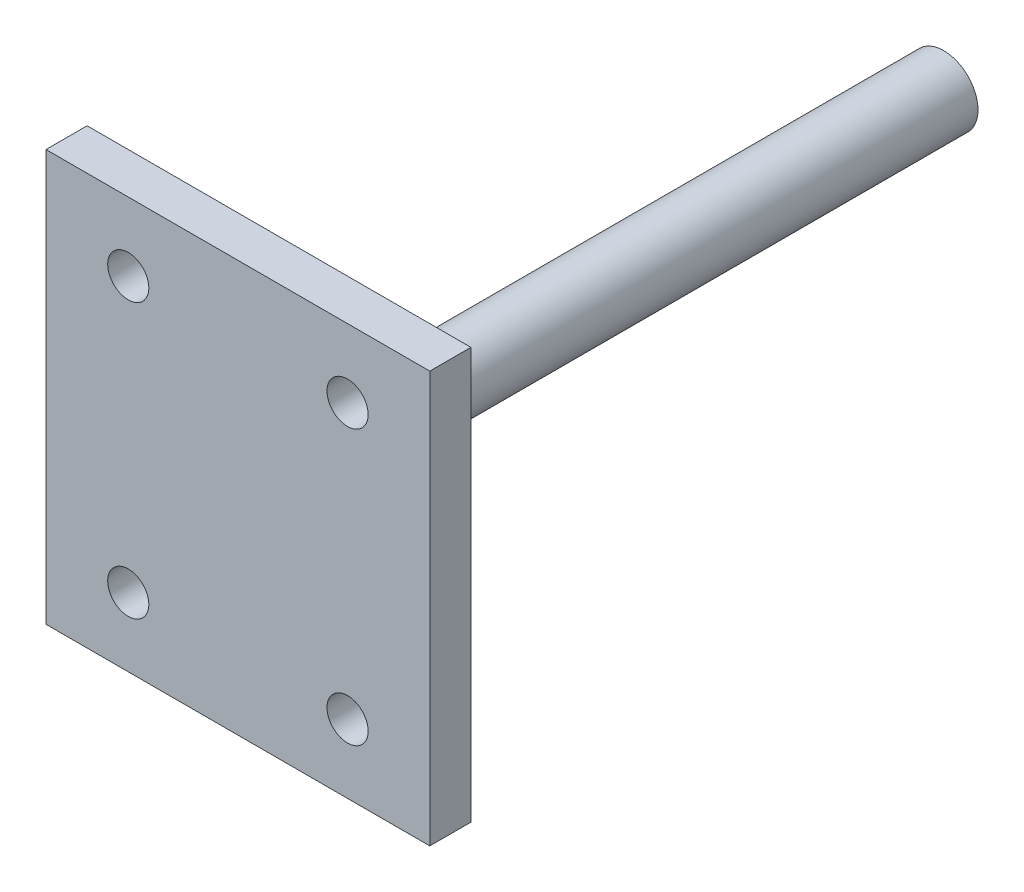
ISO-10303-21;
HEADER;
FILE_DESCRIPTION(('STEP AP214'),'2;1');
FILE_NAME('part.step','',(''),(''),'','','');
FILE_SCHEMA(('AUTOMOTIVE_DESIGN { 1 0 10303 214 1 1 1 1 }'));
ENDSEC;
DATA;
#1=APPLICATION_CONTEXT('core data for automotive mechanical design processes');
#2=APPLICATION_PROTOCOL_DEFINITION('international standard','automotive_design',2000,#1);
#3=PRODUCT_CONTEXT('',#1,'mechanical');
#4=PRODUCT('Part','Part','',(#3));
#5=PRODUCT_RELATED_PRODUCT_CATEGORY('part','',(#4));
#6=PRODUCT_DEFINITION_FORMATION('','',#4);
#7=PRODUCT_DEFINITION_CONTEXT('part definition',#1,'design');
#8=PRODUCT_DEFINITION('design','',#6,#7);
#9=PRODUCT_DEFINITION_SHAPE('','',#8);
#10=(LENGTH_UNIT() NAMED_UNIT(*) SI_UNIT(.MILLI.,.METRE.));
#11=(NAMED_UNIT(*) PLANE_ANGLE_UNIT() SI_UNIT($,.RADIAN.));
#12=(NAMED_UNIT(*) SI_UNIT($,.STERADIAN.) SOLID_ANGLE_UNIT());
#13=UNCERTAINTY_MEASURE_WITH_UNIT(LENGTH_MEASURE(1.E-05),#10,'distance_accuracy_value','');
#14=(GEOMETRIC_REPRESENTATION_CONTEXT(3) GLOBAL_UNCERTAINTY_ASSIGNED_CONTEXT((#13)) GLOBAL_UNIT_ASSIGNED_CONTEXT((#10,
#11,#12)) REPRESENTATION_CONTEXT('',''));
#15=CARTESIAN_POINT('',(0.,0.,0.));
#16=DIRECTION('',(0.,0.,1.));
#17=DIRECTION('',(1.,0.,0.));
#18=AXIS2_PLACEMENT_3D('',#15,#16,#17);
#19=CARTESIAN_POINT('',(0.,0.,3.));
#20=DIRECTION('',(1.,0.,0.));
#21=DIRECTION('',(0.,1.,0.));
#22=AXIS2_PLACEMENT_3D('',#19,#20,#21);
#23=PLANE('',#22);
#24=DIRECTION('',(0.,-1.,0.));
#25=VECTOR('',#24,1.);
#26=CARTESIAN_POINT('',(0.,0.,0.));
#27=LINE('',#26,#25);
#28=CARTESIAN_POINT('',(0.,30.,0.));
#29=VERTEX_POINT('',#28);
#30=CARTESIAN_POINT('',(0.,0.,0.));
#31=VERTEX_POINT('',#30);
#32=EDGE_CURVE('E98',#29,#31,#27,.T.);
#33=ORIENTED_EDGE('',*,*,#32,.T.);
#34=DIRECTION('',(0.,0.,-1.));
#35=VECTOR('',#34,1.);
#36=CARTESIAN_POINT('',(0.,0.,3.));
#37=LINE('',#36,#35);
#38=CARTESIAN_POINT('',(0.,0.,3.));
#39=VERTEX_POINT('',#38);
#40=EDGE_CURVE('E11',#39,#31,#37,.T.);
#41=ORIENTED_EDGE('',*,*,#40,.F.);
#42=DIRECTION('',(0.,-1.,0.));
#43=VECTOR('',#42,1.);
#44=CARTESIAN_POINT('',(0.,0.,3.));
#45=LINE('',#44,#43);
#46=CARTESIAN_POINT('',(0.,30.,3.));
#47=VERTEX_POINT('',#46);
#48=EDGE_CURVE('E86',#47,#39,#45,.T.);
#49=ORIENTED_EDGE('',*,*,#48,.F.);
#50=DIRECTION('',(0.,0.,-1.));
#51=VECTOR('',#50,1.);
#52=CARTESIAN_POINT('',(0.,30.,3.));
#53=LINE('',#52,#51);
#54=EDGE_CURVE('E94',#47,#29,#53,.T.);
#55=ORIENTED_EDGE('',*,*,#54,.T.);
#56=EDGE_LOOP('',(#33,#41,#49,#55));
#57=FACE_BOUND('',#56,.T.);
#58=ADVANCED_FACE('F35',(#57),#23,.F.);
#59=CARTESIAN_POINT('',(0.,0.,3.));
#60=DIRECTION('',(0.,1.,0.));
#61=DIRECTION('',(0.,0.,1.));
#62=AXIS2_PLACEMENT_3D('',#59,#60,#61);
#63=PLANE('',#62);
#64=DIRECTION('',(1.,0.,0.));
#65=VECTOR('',#64,1.);
#66=CARTESIAN_POINT('',(0.,0.,0.));
#67=LINE('',#66,#65);
#68=CARTESIAN_POINT('',(28.,0.,0.));
#69=VERTEX_POINT('',#68);
#70=EDGE_CURVE('E90',#31,#69,#67,.T.);
#71=ORIENTED_EDGE('',*,*,#70,.T.);
#72=DIRECTION('',(0.,0.,-1.));
#73=VECTOR('',#72,1.);
#74=CARTESIAN_POINT('',(28.,0.,3.));
#75=LINE('',#74,#73);
#76=CARTESIAN_POINT('',(28.,0.,3.));
#77=VERTEX_POINT('',#76);
#78=EDGE_CURVE('E43',#77,#69,#75,.T.);
#79=ORIENTED_EDGE('',*,*,#78,.F.);
#80=DIRECTION('',(1.,0.,0.));
#81=VECTOR('',#80,1.);
#82=CARTESIAN_POINT('',(0.,0.,3.));
#83=LINE('',#82,#81);
#84=EDGE_CURVE('E81',#39,#77,#83,.T.);
#85=ORIENTED_EDGE('',*,*,#84,.F.);
#86=ORIENTED_EDGE('',*,*,#40,.T.);
#87=EDGE_LOOP('',(#71,#79,#85,#86));
#88=FACE_BOUND('',#87,.T.);
#89=ADVANCED_FACE('F89',(#88),#63,.F.);
#90=CARTESIAN_POINT('',(28.,0.,3.));
#91=DIRECTION('',(-1.,0.,0.));
#92=DIRECTION('',(0.,-1.,0.));
#93=AXIS2_PLACEMENT_3D('',#90,#91,#92);
#94=PLANE('',#93);
#95=DIRECTION('',(0.,1.,0.));
#96=VECTOR('',#95,1.);
#97=CARTESIAN_POINT('',(28.,0.,0.));
#98=LINE('',#97,#96);
#99=CARTESIAN_POINT('',(28.,30.,0.));
#100=VERTEX_POINT('',#99);
#101=EDGE_CURVE('E68',#69,#100,#98,.T.);
#102=ORIENTED_EDGE('',*,*,#101,.T.);
#103=DIRECTION('',(0.,0.,-1.));
#104=VECTOR('',#103,1.);
#105=CARTESIAN_POINT('',(28.,30.,3.));
#106=LINE('',#105,#104);
#107=CARTESIAN_POINT('',(28.,30.,3.));
#108=VERTEX_POINT('',#107);
#109=EDGE_CURVE('E91',#108,#100,#106,.T.);
#110=ORIENTED_EDGE('',*,*,#109,.F.);
#111=DIRECTION('',(0.,1.,0.));
#112=VECTOR('',#111,1.);
#113=CARTESIAN_POINT('',(28.,0.,3.));
#114=LINE('',#113,#112);
#115=EDGE_CURVE('E84',#77,#108,#114,.T.);
#116=ORIENTED_EDGE('',*,*,#115,.F.);
#117=ORIENTED_EDGE('',*,*,#78,.T.);
#118=EDGE_LOOP('',(#102,#110,#116,#117));
#119=FACE_BOUND('',#118,.T.);
#120=ADVANCED_FACE('F92',(#119),#94,.F.);
#121=CARTESIAN_POINT('',(0.,30.,3.));
#122=DIRECTION('',(0.,-1.,0.));
#123=DIRECTION('',(0.,0.,-1.));
#124=AXIS2_PLACEMENT_3D('',#121,#122,#123);
#125=PLANE('',#124);
#126=DIRECTION('',(-1.,0.,0.));
#127=VECTOR('',#126,1.);
#128=CARTESIAN_POINT('',(0.,30.,0.));
#129=LINE('',#128,#127);
#130=EDGE_CURVE('E74',#100,#29,#129,.T.);
#131=ORIENTED_EDGE('',*,*,#130,.T.);
#132=ORIENTED_EDGE('',*,*,#54,.F.);
#133=DIRECTION('',(-1.,0.,0.));
#134=VECTOR('',#133,1.);
#135=CARTESIAN_POINT('',(0.,30.,3.));
#136=LINE('',#135,#134);
#137=EDGE_CURVE('E51',#108,#47,#136,.T.);
#138=ORIENTED_EDGE('',*,*,#137,.F.);
#139=ORIENTED_EDGE('',*,*,#109,.T.);
#140=EDGE_LOOP('',(#131,#132,#138,#139));
#141=FACE_BOUND('',#140,.T.);
#142=ADVANCED_FACE('F106',(#141),#125,.F.);
#143=CARTESIAN_POINT('',(0.,0.,3.));
#144=DIRECTION('',(0.,0.,-1.));
#145=DIRECTION('',(-1.,0.,0.));
#146=AXIS2_PLACEMENT_3D('',#143,#144,#145);
#147=PLANE('',#146);
#148=CARTESIAN_POINT('',(6.,5.,3.));
#149=DIRECTION('',(0.,0.,-1.));
#150=DIRECTION('',(-1.,0.,0.));
#151=AXIS2_PLACEMENT_3D('',#148,#149,#150);
#152=CIRCLE('',#151,1.5);
#153=CARTESIAN_POINT('',(4.5,5.,3.));
#154=VERTEX_POINT('',#153);
#155=EDGE_CURVE('E101',#154,#154,#152,.F.);
#156=ORIENTED_EDGE('',*,*,#155,.F.);
#157=EDGE_LOOP('',(#156));
#158=FACE_BOUND('',#157,.T.);
#159=CARTESIAN_POINT('',(22.,5.,3.));
#160=DIRECTION('',(0.,0.,-1.));
#161=DIRECTION('',(-1.,0.,0.));
#162=AXIS2_PLACEMENT_3D('',#159,#160,#161);
#163=CIRCLE('',#162,1.5);
#164=CARTESIAN_POINT('',(20.5,5.,3.));
#165=VERTEX_POINT('',#164);
#166=EDGE_CURVE('E114',#165,#165,#163,.F.);
#167=ORIENTED_EDGE('',*,*,#166,.F.);
#168=EDGE_LOOP('',(#167));
#169=FACE_BOUND('',#168,.T.);
#170=CARTESIAN_POINT('',(22.,25.,3.));
#171=DIRECTION('',(0.,0.,-1.));
#172=DIRECTION('',(-1.,0.,0.));
#173=AXIS2_PLACEMENT_3D('',#170,#171,#172);
#174=CIRCLE('',#173,1.5);
#175=CARTESIAN_POINT('',(20.5,25.,3.));
#176=VERTEX_POINT('',#175);
#177=EDGE_CURVE('E117',#176,#176,#174,.F.);
#178=ORIENTED_EDGE('',*,*,#177,.F.);
#179=EDGE_LOOP('',(#178));
#180=FACE_BOUND('',#179,.T.);
#181=CARTESIAN_POINT('',(6.,25.,3.));
#182=DIRECTION('',(0.,0.,-1.));
#183=DIRECTION('',(-1.,0.,0.));
#184=AXIS2_PLACEMENT_3D('',#181,#182,#183);
#185=CIRCLE('',#184,1.5);
#186=CARTESIAN_POINT('',(4.5,25.,3.));
#187=VERTEX_POINT('',#186);
#188=EDGE_CURVE('E120',#187,#187,#185,.F.);
#189=ORIENTED_EDGE('',*,*,#188,.F.);
#190=EDGE_LOOP('',(#189));
#191=FACE_BOUND('',#190,.T.);
#192=ORIENTED_EDGE('',*,*,#48,.T.);
#193=ORIENTED_EDGE('',*,*,#84,.T.);
#194=ORIENTED_EDGE('',*,*,#115,.T.);
#195=ORIENTED_EDGE('',*,*,#137,.T.);
#196=EDGE_LOOP('',(#192,#193,#194,#195));
#197=FACE_BOUND('',#196,.T.);
#198=ADVANCED_FACE('F82',(#158,#169,#180,#191,#197),#147,.F.);
#199=CARTESIAN_POINT('',(0.,0.,0.));
#200=DIRECTION('',(0.,0.,-1.));
#201=DIRECTION('',(-1.,0.,0.));
#202=AXIS2_PLACEMENT_3D('',#199,#200,#201);
#203=PLANE('',#202);
#204=CARTESIAN_POINT('',(14.000000000005,14.9999999999932,0.));
#205=DIRECTION('',(0.,0.,-1.));
#206=DIRECTION('',(-1.,0.,0.));
#207=AXIS2_PLACEMENT_3D('',#204,#205,#206);
#208=CIRCLE('',#207,2.495);
#209=CARTESIAN_POINT('',(16.495000000005,14.9999999999932,0.));
#210=VERTEX_POINT('',#209);
#211=EDGE_CURVE('E136',#210,#210,#208,.T.);
#212=ORIENTED_EDGE('',*,*,#211,.F.);
#213=EDGE_LOOP('',(#212));
#214=FACE_BOUND('',#213,.T.);
#215=CARTESIAN_POINT('',(6.,5.,0.));
#216=DIRECTION('',(0.,0.,-1.));
#217=DIRECTION('',(-1.,0.,0.));
#218=AXIS2_PLACEMENT_3D('',#215,#216,#217);
#219=CIRCLE('',#218,1.5);
#220=CARTESIAN_POINT('',(4.5,5.,0.));
#221=VERTEX_POINT('',#220);
#222=EDGE_CURVE('E127',#221,#221,#219,.F.);
#223=ORIENTED_EDGE('',*,*,#222,.T.);
#224=EDGE_LOOP('',(#223));
#225=FACE_BOUND('',#224,.T.);
#226=CARTESIAN_POINT('',(22.,5.,0.));
#227=DIRECTION('',(0.,0.,-1.));
#228=DIRECTION('',(-1.,0.,0.));
#229=AXIS2_PLACEMENT_3D('',#226,#227,#228);
#230=CIRCLE('',#229,1.5);
#231=CARTESIAN_POINT('',(20.5,5.,0.));
#232=VERTEX_POINT('',#231);
#233=EDGE_CURVE('E130',#232,#232,#230,.F.);
#234=ORIENTED_EDGE('',*,*,#233,.T.);
#235=EDGE_LOOP('',(#234));
#236=FACE_BOUND('',#235,.T.);
#237=CARTESIAN_POINT('',(22.,25.,0.));
#238=DIRECTION('',(0.,0.,-1.));
#239=DIRECTION('',(-1.,0.,0.));
#240=AXIS2_PLACEMENT_3D('',#237,#238,#239);
#241=CIRCLE('',#240,1.5);
#242=CARTESIAN_POINT('',(20.5,25.,0.));
#243=VERTEX_POINT('',#242);
#244=EDGE_CURVE('E126',#243,#243,#241,.F.);
#245=ORIENTED_EDGE('',*,*,#244,.T.);
#246=EDGE_LOOP('',(#245));
#247=FACE_BOUND('',#246,.T.);
#248=CARTESIAN_POINT('',(6.,25.,0.));
#249=DIRECTION('',(0.,0.,-1.));
#250=DIRECTION('',(-1.,0.,0.));
#251=AXIS2_PLACEMENT_3D('',#248,#249,#250);
#252=CIRCLE('',#251,1.5);
#253=CARTESIAN_POINT('',(4.5,25.,0.));
#254=VERTEX_POINT('',#253);
#255=EDGE_CURVE('E123',#254,#254,#252,.F.);
#256=ORIENTED_EDGE('',*,*,#255,.T.);
#257=EDGE_LOOP('',(#256));
#258=FACE_BOUND('',#257,.T.);
#259=ORIENTED_EDGE('',*,*,#32,.F.);
#260=ORIENTED_EDGE('',*,*,#130,.F.);
#261=ORIENTED_EDGE('',*,*,#101,.F.);
#262=ORIENTED_EDGE('',*,*,#70,.F.);
#263=EDGE_LOOP('',(#259,#260,#261,#262));
#264=FACE_BOUND('',#263,.T.);
#265=ADVANCED_FACE('F109',(#214,#225,#236,#247,#258,#264),#203,.T.);
#266=CARTESIAN_POINT('',(6.,25.,3.000012));
#267=DIRECTION('',(0.,0.,-1.));
#268=DIRECTION('',(-1.,0.,0.));
#269=AXIS2_PLACEMENT_3D('',#266,#267,#268);
#270=CYLINDRICAL_SURFACE('',#269,1.5);
#271=CARTESIAN_POINT('',(4.5,25.,0.));
#272=CARTESIAN_POINT('',(4.5,25.,0.03125));
#273=CARTESIAN_POINT('',(4.5,25.,0.0625000000000001));
#274=CARTESIAN_POINT('',(4.5,25.,0.125));
#275=CARTESIAN_POINT('',(4.5,25.,0.15625));
#276=CARTESIAN_POINT('',(4.5,25.,0.21875));
#277=CARTESIAN_POINT('',(4.5,25.,0.25));
#278=CARTESIAN_POINT('',(4.5,25.,0.3125));
#279=CARTESIAN_POINT('',(4.5,25.,0.34375));
#280=CARTESIAN_POINT('',(4.5,25.,0.40625));
#281=CARTESIAN_POINT('',(4.5,25.,0.4375));
#282=CARTESIAN_POINT('',(4.5,25.,0.5));
#283=CARTESIAN_POINT('',(4.5,25.,0.53125));
#284=CARTESIAN_POINT('',(4.5,25.,0.59375));
#285=CARTESIAN_POINT('',(4.5,25.,0.625));
#286=CARTESIAN_POINT('',(4.5,25.,0.6875));
#287=CARTESIAN_POINT('',(4.5,25.,0.71875));
#288=CARTESIAN_POINT('',(4.5,25.,0.78125));
#289=CARTESIAN_POINT('',(4.5,25.,0.8125));
#290=CARTESIAN_POINT('',(4.5,25.,0.875));
#291=CARTESIAN_POINT('',(4.5,25.,0.90625));
#292=CARTESIAN_POINT('',(4.5,25.,0.96875));
#293=CARTESIAN_POINT('',(4.5,25.,1.));
#294=CARTESIAN_POINT('',(4.5,25.,1.0625));
#295=CARTESIAN_POINT('',(4.5,25.,1.09375));
#296=CARTESIAN_POINT('',(4.5,25.,1.15625));
#297=CARTESIAN_POINT('',(4.5,25.,1.1875));
#298=CARTESIAN_POINT('',(4.5,25.,1.25));
#299=CARTESIAN_POINT('',(4.5,25.,1.28125));
#300=CARTESIAN_POINT('',(4.5,25.,1.34375));
#301=CARTESIAN_POINT('',(4.5,25.,1.375));
#302=CARTESIAN_POINT('',(4.5,25.,1.4375));
#303=CARTESIAN_POINT('',(4.5,25.,1.46875));
#304=CARTESIAN_POINT('',(4.5,25.,1.53125));
#305=CARTESIAN_POINT('',(4.5,25.,1.5625));
#306=CARTESIAN_POINT('',(4.5,25.,1.625));
#307=CARTESIAN_POINT('',(4.5,25.,1.65625));
#308=CARTESIAN_POINT('',(4.5,25.,1.71875));
#309=CARTESIAN_POINT('',(4.5,25.,1.75));
#310=CARTESIAN_POINT('',(4.5,25.,1.8125));
#311=CARTESIAN_POINT('',(4.5,25.,1.84375));
#312=CARTESIAN_POINT('',(4.5,25.,1.90625));
#313=CARTESIAN_POINT('',(4.5,25.,1.9375));
#314=CARTESIAN_POINT('',(4.5,25.,2.));
#315=CARTESIAN_POINT('',(4.5,25.,2.03125));
#316=CARTESIAN_POINT('',(4.5,25.,2.09375));
#317=CARTESIAN_POINT('',(4.5,25.,2.125));
#318=CARTESIAN_POINT('',(4.5,25.,2.1875));
#319=CARTESIAN_POINT('',(4.5,25.,2.21875));
#320=CARTESIAN_POINT('',(4.5,25.,2.28125));
#321=CARTESIAN_POINT('',(4.5,25.,2.3125));
#322=CARTESIAN_POINT('',(4.5,25.,2.375));
#323=CARTESIAN_POINT('',(4.5,25.,2.40625));
#324=CARTESIAN_POINT('',(4.5,25.,2.46875));
#325=CARTESIAN_POINT('',(4.5,25.,2.5));
#326=CARTESIAN_POINT('',(4.5,25.,2.5625));
#327=CARTESIAN_POINT('',(4.5,25.,2.59375));
#328=CARTESIAN_POINT('',(4.5,25.,2.65625));
#329=CARTESIAN_POINT('',(4.5,25.,2.6875));
#330=CARTESIAN_POINT('',(4.5,25.,2.75));
#331=CARTESIAN_POINT('',(4.5,25.,2.78125));
#332=CARTESIAN_POINT('',(4.5,25.,2.84375));
#333=CARTESIAN_POINT('',(4.5,25.,2.875));
#334=CARTESIAN_POINT('',(4.5,25.,2.9375));
#335=CARTESIAN_POINT('',(4.5,25.,2.96875));
#336=CARTESIAN_POINT('',(4.5,25.,3.));
#337=B_SPLINE_CURVE_WITH_KNOTS('',3,(#271,#272,#273,#274,#275,#276,#277,#278,#279,#280,#281,
#282,#283,#284,#285,#286,#287,#288,#289,#290,#291,#292,#293,#294,#295,#296,#297,#298,#299,#300,
#301,#302,#303,#304,#305,#306,#307,#308,#309,#310,#311,#312,#313,#314,#315,#316,#317,#318,#319,
#320,#321,#322,#323,#324,#325,#326,#327,#328,#329,#330,#331,#332,#333,#334,#335,#336),
.UNSPECIFIED.,.F.,.F.,(4,2,2,2,2,2,2,2,2,2,2,2,2,2,2,2,2,2,2,2,2,2,2,2,2,2,2,2,2,2,2,2,4),(0.,
0.0937500000000001,0.1875,0.28125,0.375,0.46875,0.5625,0.65625,0.75,0.84375,0.9375,1.03125,
1.125,1.21875,1.3125,1.40625,1.5,1.59375,1.6875,1.78125,1.875,1.96875,2.0625,2.15625,2.25,
2.34375,2.4375,2.53125,2.625,2.71875,2.8125,2.90625,3.),.UNSPECIFIED.);
#338=EDGE_CURVE('BSEAM153',#254,#187,#337,.T.);
#339=ORIENTED_EDGE('',*,*,#255,.F.);
#340=ORIENTED_EDGE('',*,*,#188,.T.);
#341=ORIENTED_EDGE('',*,*,#338,.T.);
#342=ORIENTED_EDGE('',*,*,#338,.F.);
#343=EDGE_LOOP('',(#339,#341,#340,#342));
#344=FACE_BOUND('',#343,.T.);
#345=ADVANCED_FACE('F153',(#344),#270,.F.);
#346=CARTESIAN_POINT('',(22.,25.,3.000012));
#347=DIRECTION('',(0.,0.,-1.));
#348=DIRECTION('',(-1.,0.,0.));
#349=AXIS2_PLACEMENT_3D('',#346,#347,#348);
#350=CYLINDRICAL_SURFACE('',#349,1.5);
#351=CARTESIAN_POINT('',(20.5,25.,0.));
#352=CARTESIAN_POINT('',(20.5,25.,0.03125));
#353=CARTESIAN_POINT('',(20.5,25.,0.0625000000000001));
#354=CARTESIAN_POINT('',(20.5,25.,0.125));
#355=CARTESIAN_POINT('',(20.5,25.,0.15625));
#356=CARTESIAN_POINT('',(20.5,25.,0.21875));
#357=CARTESIAN_POINT('',(20.5,25.,0.25));
#358=CARTESIAN_POINT('',(20.5,25.,0.3125));
#359=CARTESIAN_POINT('',(20.5,25.,0.34375));
#360=CARTESIAN_POINT('',(20.5,25.,0.40625));
#361=CARTESIAN_POINT('',(20.5,25.,0.4375));
#362=CARTESIAN_POINT('',(20.5,25.,0.5));
#363=CARTESIAN_POINT('',(20.5,25.,0.53125));
#364=CARTESIAN_POINT('',(20.5,25.,0.59375));
#365=CARTESIAN_POINT('',(20.5,25.,0.625));
#366=CARTESIAN_POINT('',(20.5,25.,0.6875));
#367=CARTESIAN_POINT('',(20.5,25.,0.71875));
#368=CARTESIAN_POINT('',(20.5,25.,0.78125));
#369=CARTESIAN_POINT('',(20.5,25.,0.8125));
#370=CARTESIAN_POINT('',(20.5,25.,0.875));
#371=CARTESIAN_POINT('',(20.5,25.,0.90625));
#372=CARTESIAN_POINT('',(20.5,25.,0.96875));
#373=CARTESIAN_POINT('',(20.5,25.,1.));
#374=CARTESIAN_POINT('',(20.5,25.,1.0625));
#375=CARTESIAN_POINT('',(20.5,25.,1.09375));
#376=CARTESIAN_POINT('',(20.5,25.,1.15625));
#377=CARTESIAN_POINT('',(20.5,25.,1.1875));
#378=CARTESIAN_POINT('',(20.5,25.,1.25));
#379=CARTESIAN_POINT('',(20.5,25.,1.28125));
#380=CARTESIAN_POINT('',(20.5,25.,1.34375));
#381=CARTESIAN_POINT('',(20.5,25.,1.375));
#382=CARTESIAN_POINT('',(20.5,25.,1.4375));
#383=CARTESIAN_POINT('',(20.5,25.,1.46875));
#384=CARTESIAN_POINT('',(20.5,25.,1.53125));
#385=CARTESIAN_POINT('',(20.5,25.,1.5625));
#386=CARTESIAN_POINT('',(20.5,25.,1.625));
#387=CARTESIAN_POINT('',(20.5,25.,1.65625));
#388=CARTESIAN_POINT('',(20.5,25.,1.71875));
#389=CARTESIAN_POINT('',(20.5,25.,1.75));
#390=CARTESIAN_POINT('',(20.5,25.,1.8125));
#391=CARTESIAN_POINT('',(20.5,25.,1.84375));
#392=CARTESIAN_POINT('',(20.5,25.,1.90625));
#393=CARTESIAN_POINT('',(20.5,25.,1.9375));
#394=CARTESIAN_POINT('',(20.5,25.,2.));
#395=CARTESIAN_POINT('',(20.5,25.,2.03125));
#396=CARTESIAN_POINT('',(20.5,25.,2.09375));
#397=CARTESIAN_POINT('',(20.5,25.,2.125));
#398=CARTESIAN_POINT('',(20.5,25.,2.1875));
#399=CARTESIAN_POINT('',(20.5,25.,2.21875));
#400=CARTESIAN_POINT('',(20.5,25.,2.28125));
#401=CARTESIAN_POINT('',(20.5,25.,2.3125));
#402=CARTESIAN_POINT('',(20.5,25.,2.375));
#403=CARTESIAN_POINT('',(20.5,25.,2.40625));
#404=CARTESIAN_POINT('',(20.5,25.,2.46875));
#405=CARTESIAN_POINT('',(20.5,25.,2.5));
#406=CARTESIAN_POINT('',(20.5,25.,2.5625));
#407=CARTESIAN_POINT('',(20.5,25.,2.59375));
#408=CARTESIAN_POINT('',(20.5,25.,2.65625));
#409=CARTESIAN_POINT('',(20.5,25.,2.6875));
#410=CARTESIAN_POINT('',(20.5,25.,2.75));
#411=CARTESIAN_POINT('',(20.5,25.,2.78125));
#412=CARTESIAN_POINT('',(20.5,25.,2.84375));
#413=CARTESIAN_POINT('',(20.5,25.,2.875));
#414=CARTESIAN_POINT('',(20.5,25.,2.9375));
#415=CARTESIAN_POINT('',(20.5,25.,2.96875));
#416=CARTESIAN_POINT('',(20.5,25.,3.));
#417=B_SPLINE_CURVE_WITH_KNOTS('',3,(#351,#352,#353,#354,#355,#356,#357,#358,#359,#360,#361,
#362,#363,#364,#365,#366,#367,#368,#369,#370,#371,#372,#373,#374,#375,#376,#377,#378,#379,#380,
#381,#382,#383,#384,#385,#386,#387,#388,#389,#390,#391,#392,#393,#394,#395,#396,#397,#398,#399,
#400,#401,#402,#403,#404,#405,#406,#407,#408,#409,#410,#411,#412,#413,#414,#415,#416),
.UNSPECIFIED.,.F.,.F.,(4,2,2,2,2,2,2,2,2,2,2,2,2,2,2,2,2,2,2,2,2,2,2,2,2,2,2,2,2,2,2,2,4),(0.,
0.0937500000000001,0.1875,0.28125,0.375,0.46875,0.5625,0.65625,0.75,0.84375,0.9375,1.03125,
1.125,1.21875,1.3125,1.40625,1.5,1.59375,1.6875,1.78125,1.875,1.96875,2.0625,2.15625,2.25,
2.34375,2.4375,2.53125,2.625,2.71875,2.8125,2.90625,3.),.UNSPECIFIED.);
#418=EDGE_CURVE('BSEAM165',#243,#176,#417,.T.);
#419=ORIENTED_EDGE('',*,*,#244,.F.);
#420=ORIENTED_EDGE('',*,*,#177,.T.);
#421=ORIENTED_EDGE('',*,*,#418,.T.);
#422=ORIENTED_EDGE('',*,*,#418,.F.);
#423=EDGE_LOOP('',(#419,#421,#420,#422));
#424=FACE_BOUND('',#423,.T.);
#425=ADVANCED_FACE('F165',(#424),#350,.F.);
#426=CARTESIAN_POINT('',(22.,5.,3.000012));
#427=DIRECTION('',(0.,0.,-1.));
#428=DIRECTION('',(-1.,0.,0.));
#429=AXIS2_PLACEMENT_3D('',#426,#427,#428);
#430=CYLINDRICAL_SURFACE('',#429,1.5);
#431=CARTESIAN_POINT('',(20.5,5.,0.));
#432=CARTESIAN_POINT('',(20.5,5.,0.03125));
#433=CARTESIAN_POINT('',(20.5,5.,0.0625000000000001));
#434=CARTESIAN_POINT('',(20.5,5.,0.125));
#435=CARTESIAN_POINT('',(20.5,5.,0.15625));
#436=CARTESIAN_POINT('',(20.5,5.,0.21875));
#437=CARTESIAN_POINT('',(20.5,5.,0.25));
#438=CARTESIAN_POINT('',(20.5,5.,0.3125));
#439=CARTESIAN_POINT('',(20.5,5.,0.34375));
#440=CARTESIAN_POINT('',(20.5,5.,0.40625));
#441=CARTESIAN_POINT('',(20.5,5.,0.4375));
#442=CARTESIAN_POINT('',(20.5,5.,0.5));
#443=CARTESIAN_POINT('',(20.5,5.,0.53125));
#444=CARTESIAN_POINT('',(20.5,5.,0.59375));
#445=CARTESIAN_POINT('',(20.5,5.,0.625));
#446=CARTESIAN_POINT('',(20.5,5.,0.6875));
#447=CARTESIAN_POINT('',(20.5,5.,0.71875));
#448=CARTESIAN_POINT('',(20.5,5.,0.78125));
#449=CARTESIAN_POINT('',(20.5,5.,0.8125));
#450=CARTESIAN_POINT('',(20.5,5.,0.875));
#451=CARTESIAN_POINT('',(20.5,5.,0.90625));
#452=CARTESIAN_POINT('',(20.5,5.,0.96875));
#453=CARTESIAN_POINT('',(20.5,5.,1.));
#454=CARTESIAN_POINT('',(20.5,5.,1.0625));
#455=CARTESIAN_POINT('',(20.5,5.,1.09375));
#456=CARTESIAN_POINT('',(20.5,5.,1.15625));
#457=CARTESIAN_POINT('',(20.5,5.,1.1875));
#458=CARTESIAN_POINT('',(20.5,5.,1.25));
#459=CARTESIAN_POINT('',(20.5,5.,1.28125));
#460=CARTESIAN_POINT('',(20.5,5.,1.34375));
#461=CARTESIAN_POINT('',(20.5,5.,1.375));
#462=CARTESIAN_POINT('',(20.5,5.,1.4375));
#463=CARTESIAN_POINT('',(20.5,5.,1.46875));
#464=CARTESIAN_POINT('',(20.5,5.,1.53125));
#465=CARTESIAN_POINT('',(20.5,5.,1.5625));
#466=CARTESIAN_POINT('',(20.5,5.,1.625));
#467=CARTESIAN_POINT('',(20.5,5.,1.65625));
#468=CARTESIAN_POINT('',(20.5,5.,1.71875));
#469=CARTESIAN_POINT('',(20.5,5.,1.75));
#470=CARTESIAN_POINT('',(20.5,5.,1.8125));
#471=CARTESIAN_POINT('',(20.5,5.,1.84375));
#472=CARTESIAN_POINT('',(20.5,5.,1.90625));
#473=CARTESIAN_POINT('',(20.5,5.,1.9375));
#474=CARTESIAN_POINT('',(20.5,5.,2.));
#475=CARTESIAN_POINT('',(20.5,5.,2.03125));
#476=CARTESIAN_POINT('',(20.5,5.,2.09375));
#477=CARTESIAN_POINT('',(20.5,5.,2.125));
#478=CARTESIAN_POINT('',(20.5,5.,2.1875));
#479=CARTESIAN_POINT('',(20.5,5.,2.21875));
#480=CARTESIAN_POINT('',(20.5,5.,2.28125));
#481=CARTESIAN_POINT('',(20.5,5.,2.3125));
#482=CARTESIAN_POINT('',(20.5,5.,2.375));
#483=CARTESIAN_POINT('',(20.5,5.,2.40625));
#484=CARTESIAN_POINT('',(20.5,5.,2.46875));
#485=CARTESIAN_POINT('',(20.5,5.,2.5));
#486=CARTESIAN_POINT('',(20.5,5.,2.5625));
#487=CARTESIAN_POINT('',(20.5,5.,2.59375));
#488=CARTESIAN_POINT('',(20.5,5.,2.65625));
#489=CARTESIAN_POINT('',(20.5,5.,2.6875));
#490=CARTESIAN_POINT('',(20.5,5.,2.75));
#491=CARTESIAN_POINT('',(20.5,5.,2.78125));
#492=CARTESIAN_POINT('',(20.5,5.,2.84375));
#493=CARTESIAN_POINT('',(20.5,5.,2.875));
#494=CARTESIAN_POINT('',(20.5,5.,2.9375));
#495=CARTESIAN_POINT('',(20.5,5.,2.96875));
#496=CARTESIAN_POINT('',(20.5,5.,3.));
#497=B_SPLINE_CURVE_WITH_KNOTS('',3,(#431,#432,#433,#434,#435,#436,#437,#438,#439,#440,#441,
#442,#443,#444,#445,#446,#447,#448,#449,#450,#451,#452,#453,#454,#455,#456,#457,#458,#459,#460,
#461,#462,#463,#464,#465,#466,#467,#468,#469,#470,#471,#472,#473,#474,#475,#476,#477,#478,#479,
#480,#481,#482,#483,#484,#485,#486,#487,#488,#489,#490,#491,#492,#493,#494,#495,#496),
.UNSPECIFIED.,.F.,.F.,(4,2,2,2,2,2,2,2,2,2,2,2,2,2,2,2,2,2,2,2,2,2,2,2,2,2,2,2,2,2,2,2,4),(0.,
0.0937500000000001,0.1875,0.28125,0.375,0.46875,0.5625,0.65625,0.75,0.84375,0.9375,1.03125,
1.125,1.21875,1.3125,1.40625,1.5,1.59375,1.6875,1.78125,1.875,1.96875,2.0625,2.15625,2.25,
2.34375,2.4375,2.53125,2.625,2.71875,2.8125,2.90625,3.),.UNSPECIFIED.);
#498=EDGE_CURVE('BSEAM212',#232,#165,#497,.T.);
#499=ORIENTED_EDGE('',*,*,#233,.F.);
#500=ORIENTED_EDGE('',*,*,#166,.T.);
#501=ORIENTED_EDGE('',*,*,#498,.T.);
#502=ORIENTED_EDGE('',*,*,#498,.F.);
#503=EDGE_LOOP('',(#499,#501,#500,#502));
#504=FACE_BOUND('',#503,.T.);
#505=ADVANCED_FACE('F212',(#504),#430,.F.);
#506=CARTESIAN_POINT('',(6.,5.,3.000012));
#507=DIRECTION('',(0.,0.,-1.));
#508=DIRECTION('',(-1.,0.,0.));
#509=AXIS2_PLACEMENT_3D('',#506,#507,#508);
#510=CYLINDRICAL_SURFACE('',#509,1.5);
#511=CARTESIAN_POINT('',(4.5,5.,0.));
#512=CARTESIAN_POINT('',(4.5,5.,0.03125));
#513=CARTESIAN_POINT('',(4.5,5.,0.0625000000000001));
#514=CARTESIAN_POINT('',(4.5,5.,0.125));
#515=CARTESIAN_POINT('',(4.5,5.,0.15625));
#516=CARTESIAN_POINT('',(4.5,5.,0.21875));
#517=CARTESIAN_POINT('',(4.5,5.,0.25));
#518=CARTESIAN_POINT('',(4.5,5.,0.3125));
#519=CARTESIAN_POINT('',(4.5,5.,0.34375));
#520=CARTESIAN_POINT('',(4.5,5.,0.40625));
#521=CARTESIAN_POINT('',(4.5,5.,0.4375));
#522=CARTESIAN_POINT('',(4.5,5.,0.5));
#523=CARTESIAN_POINT('',(4.5,5.,0.53125));
#524=CARTESIAN_POINT('',(4.5,5.,0.59375));
#525=CARTESIAN_POINT('',(4.5,5.,0.625));
#526=CARTESIAN_POINT('',(4.5,5.,0.6875));
#527=CARTESIAN_POINT('',(4.5,5.,0.71875));
#528=CARTESIAN_POINT('',(4.5,5.,0.78125));
#529=CARTESIAN_POINT('',(4.5,5.,0.8125));
#530=CARTESIAN_POINT('',(4.5,5.,0.875));
#531=CARTESIAN_POINT('',(4.5,5.,0.90625));
#532=CARTESIAN_POINT('',(4.5,5.,0.96875));
#533=CARTESIAN_POINT('',(4.5,5.,1.));
#534=CARTESIAN_POINT('',(4.5,5.,1.0625));
#535=CARTESIAN_POINT('',(4.5,5.,1.09375));
#536=CARTESIAN_POINT('',(4.5,5.,1.15625));
#537=CARTESIAN_POINT('',(4.5,5.,1.1875));
#538=CARTESIAN_POINT('',(4.5,5.,1.25));
#539=CARTESIAN_POINT('',(4.5,5.,1.28125));
#540=CARTESIAN_POINT('',(4.5,5.,1.34375));
#541=CARTESIAN_POINT('',(4.5,5.,1.375));
#542=CARTESIAN_POINT('',(4.5,5.,1.4375));
#543=CARTESIAN_POINT('',(4.5,5.,1.46875));
#544=CARTESIAN_POINT('',(4.5,5.,1.53125));
#545=CARTESIAN_POINT('',(4.5,5.,1.5625));
#546=CARTESIAN_POINT('',(4.5,5.,1.625));
#547=CARTESIAN_POINT('',(4.5,5.,1.65625));
#548=CARTESIAN_POINT('',(4.5,5.,1.71875));
#549=CARTESIAN_POINT('',(4.5,5.,1.75));
#550=CARTESIAN_POINT('',(4.5,5.,1.8125));
#551=CARTESIAN_POINT('',(4.5,5.,1.84375));
#552=CARTESIAN_POINT('',(4.5,5.,1.90625));
#553=CARTESIAN_POINT('',(4.5,5.,1.9375));
#554=CARTESIAN_POINT('',(4.5,5.,2.));
#555=CARTESIAN_POINT('',(4.5,5.,2.03125));
#556=CARTESIAN_POINT('',(4.5,5.,2.09375));
#557=CARTESIAN_POINT('',(4.5,5.,2.125));
#558=CARTESIAN_POINT('',(4.5,5.,2.1875));
#559=CARTESIAN_POINT('',(4.5,5.,2.21875));
#560=CARTESIAN_POINT('',(4.5,5.,2.28125));
#561=CARTESIAN_POINT('',(4.5,5.,2.3125));
#562=CARTESIAN_POINT('',(4.5,5.,2.375));
#563=CARTESIAN_POINT('',(4.5,5.,2.40625));
#564=CARTESIAN_POINT('',(4.5,5.,2.46875));
#565=CARTESIAN_POINT('',(4.5,5.,2.5));
#566=CARTESIAN_POINT('',(4.5,5.,2.5625));
#567=CARTESIAN_POINT('',(4.5,5.,2.59375));
#568=CARTESIAN_POINT('',(4.5,5.,2.65625));
#569=CARTESIAN_POINT('',(4.5,5.,2.6875));
#570=CARTESIAN_POINT('',(4.5,5.,2.75));
#571=CARTESIAN_POINT('',(4.5,5.,2.78125));
#572=CARTESIAN_POINT('',(4.5,5.,2.84375));
#573=CARTESIAN_POINT('',(4.5,5.,2.875));
#574=CARTESIAN_POINT('',(4.5,5.,2.9375));
#575=CARTESIAN_POINT('',(4.5,5.,2.96875));
#576=CARTESIAN_POINT('',(4.5,5.,3.));
#577=B_SPLINE_CURVE_WITH_KNOTS('',3,(#511,#512,#513,#514,#515,#516,#517,#518,#519,#520,#521,
#522,#523,#524,#525,#526,#527,#528,#529,#530,#531,#532,#533,#534,#535,#536,#537,#538,#539,#540,
#541,#542,#543,#544,#545,#546,#547,#548,#549,#550,#551,#552,#553,#554,#555,#556,#557,#558,#559,
#560,#561,#562,#563,#564,#565,#566,#567,#568,#569,#570,#571,#572,#573,#574,#575,#576),
.UNSPECIFIED.,.F.,.F.,(4,2,2,2,2,2,2,2,2,2,2,2,2,2,2,2,2,2,2,2,2,2,2,2,2,2,2,2,2,2,2,2,4),(0.,
0.0937500000000001,0.1875,0.28125,0.375,0.46875,0.5625,0.65625,0.75,0.84375,0.9375,1.03125,
1.125,1.21875,1.3125,1.40625,1.5,1.59375,1.6875,1.78125,1.875,1.96875,2.0625,2.15625,2.25,
2.34375,2.4375,2.53125,2.625,2.71875,2.8125,2.90625,3.),.UNSPECIFIED.);
#578=EDGE_CURVE('BSEAM147',#221,#154,#577,.T.);
#579=ORIENTED_EDGE('',*,*,#222,.F.);
#580=ORIENTED_EDGE('',*,*,#155,.T.);
#581=ORIENTED_EDGE('',*,*,#578,.T.);
#582=ORIENTED_EDGE('',*,*,#578,.F.);
#583=EDGE_LOOP('',(#579,#581,#580,#582));
#584=FACE_BOUND('',#583,.T.);
#585=ADVANCED_FACE('F147',(#584),#510,.F.);
#586=CARTESIAN_POINT('',(14.000000000005,14.9999999999932,-48.5));
#587=DIRECTION('',(0.,0.,1.));
#588=DIRECTION('',(1.,0.,0.));
#589=AXIS2_PLACEMENT_3D('',#586,#587,#588);
#590=CYLINDRICAL_SURFACE('',#589,2.495);
#591=CARTESIAN_POINT('',(14.000000000005,14.9999999999932,-48.5));
#592=DIRECTION('',(0.,0.,-1.));
#593=DIRECTION('',(-1.,0.,0.));
#594=AXIS2_PLACEMENT_3D('',#591,#592,#593);
#595=CIRCLE('',#594,2.495);
#596=CARTESIAN_POINT('',(16.495000000005,14.9999999999932,-48.5));
#597=VERTEX_POINT('',#596);
#598=EDGE_CURVE('E131',#597,#597,#595,.T.);
#599=CARTESIAN_POINT('',(16.495000000005,14.9999999999932,-48.5));
#600=CARTESIAN_POINT('',(16.495000000005,14.9999999999932,-47.9947916666667));
#601=CARTESIAN_POINT('',(16.495000000005,14.9999999999932,-47.4895833333333));
#602=CARTESIAN_POINT('',(16.495000000005,14.9999999999932,-46.4791666666667));
#603=CARTESIAN_POINT('',(16.495000000005,14.9999999999932,-45.9739583333333));
#604=CARTESIAN_POINT('',(16.495000000005,14.9999999999932,-44.9635416666667));
#605=CARTESIAN_POINT('',(16.495000000005,14.9999999999932,-44.4583333333333));
#606=CARTESIAN_POINT('',(16.495000000005,14.9999999999932,-43.4479166666667));
#607=CARTESIAN_POINT('',(16.495000000005,14.9999999999932,-42.9427083333333));
#608=CARTESIAN_POINT('',(16.495000000005,14.9999999999932,-41.9322916666667));
#609=CARTESIAN_POINT('',(16.495000000005,14.9999999999932,-41.4270833333333));
#610=CARTESIAN_POINT('',(16.495000000005,14.9999999999932,-40.4166666666667));
#611=CARTESIAN_POINT('',(16.495000000005,14.9999999999932,-39.9114583333333));
#612=CARTESIAN_POINT('',(16.495000000005,14.9999999999932,-38.9010416666667));
#613=CARTESIAN_POINT('',(16.495000000005,14.9999999999932,-38.3958333333333));
#614=CARTESIAN_POINT('',(16.495000000005,14.9999999999932,-37.3854166666667));
#615=CARTESIAN_POINT('',(16.495000000005,14.9999999999932,-36.8802083333333));
#616=CARTESIAN_POINT('',(16.495000000005,14.9999999999932,-35.8697916666667));
#617=CARTESIAN_POINT('',(16.495000000005,14.9999999999932,-35.3645833333333));
#618=CARTESIAN_POINT('',(16.495000000005,14.9999999999932,-34.3541666666667));
#619=CARTESIAN_POINT('',(16.495000000005,14.9999999999932,-33.8489583333333));
#620=CARTESIAN_POINT('',(16.495000000005,14.9999999999932,-32.8385416666667));
#621=CARTESIAN_POINT('',(16.495000000005,14.9999999999932,-32.3333333333333));
#622=CARTESIAN_POINT('',(16.495000000005,14.9999999999932,-31.3229166666667));
#623=CARTESIAN_POINT('',(16.495000000005,14.9999999999932,-30.8177083333333));
#624=CARTESIAN_POINT('',(16.495000000005,14.9999999999932,-29.8072916666667));
#625=CARTESIAN_POINT('',(16.495000000005,14.9999999999932,-29.3020833333333));
#626=CARTESIAN_POINT('',(16.495000000005,14.9999999999932,-28.2916666666667));
#627=CARTESIAN_POINT('',(16.495000000005,14.9999999999932,-27.7864583333333));
#628=CARTESIAN_POINT('',(16.495000000005,14.9999999999932,-26.7760416666667));
#629=CARTESIAN_POINT('',(16.495000000005,14.9999999999932,-26.2708333333333));
#630=CARTESIAN_POINT('',(16.495000000005,14.9999999999932,-25.2604166666667));
#631=CARTESIAN_POINT('',(16.495000000005,14.9999999999932,-24.7552083333333));
#632=CARTESIAN_POINT('',(16.495000000005,14.9999999999932,-23.7447916666667));
#633=CARTESIAN_POINT('',(16.495000000005,14.9999999999932,-23.2395833333333));
#634=CARTESIAN_POINT('',(16.495000000005,14.9999999999932,-22.2291666666667));
#635=CARTESIAN_POINT('',(16.495000000005,14.9999999999932,-21.7239583333333));
#636=CARTESIAN_POINT('',(16.495000000005,14.9999999999932,-20.7135416666667));
#637=CARTESIAN_POINT('',(16.495000000005,14.9999999999932,-20.2083333333333));
#638=CARTESIAN_POINT('',(16.495000000005,14.9999999999932,-19.1979166666667));
#639=CARTESIAN_POINT('',(16.495000000005,14.9999999999932,-18.6927083333333));
#640=CARTESIAN_POINT('',(16.495000000005,14.9999999999932,-17.6822916666667));
#641=CARTESIAN_POINT('',(16.495000000005,14.9999999999932,-17.1770833333333));
#642=CARTESIAN_POINT('',(16.495000000005,14.9999999999932,-16.1666666666667));
#643=CARTESIAN_POINT('',(16.495000000005,14.9999999999932,-15.6614583333333));
#644=CARTESIAN_POINT('',(16.495000000005,14.9999999999932,-14.6510416666667));
#645=CARTESIAN_POINT('',(16.495000000005,14.9999999999932,-14.1458333333333));
#646=CARTESIAN_POINT('',(16.495000000005,14.9999999999932,-13.1354166666667));
#647=CARTESIAN_POINT('',(16.495000000005,14.9999999999932,-12.6302083333333));
#648=CARTESIAN_POINT('',(16.495000000005,14.9999999999932,-11.6197916666667));
#649=CARTESIAN_POINT('',(16.495000000005,14.9999999999932,-11.1145833333333));
#650=CARTESIAN_POINT('',(16.495000000005,14.9999999999932,-10.1041666666667));
#651=CARTESIAN_POINT('',(16.495000000005,14.9999999999932,-9.59895833333333));
#652=CARTESIAN_POINT('',(16.495000000005,14.9999999999932,-8.58854166666666));
#653=CARTESIAN_POINT('',(16.495000000005,14.9999999999932,-8.08333333333333));
#654=CARTESIAN_POINT('',(16.495000000005,14.9999999999932,-7.07291666666666));
#655=CARTESIAN_POINT('',(16.495000000005,14.9999999999932,-6.56770833333333));
#656=CARTESIAN_POINT('',(16.495000000005,14.9999999999932,-5.55729166666666));
#657=CARTESIAN_POINT('',(16.495000000005,14.9999999999932,-5.05208333333333));
#658=CARTESIAN_POINT('',(16.495000000005,14.9999999999932,-4.04166666666666));
#659=CARTESIAN_POINT('',(16.495000000005,14.9999999999932,-3.53645833333333));
#660=CARTESIAN_POINT('',(16.495000000005,14.9999999999932,-2.52604166666666));
#661=CARTESIAN_POINT('',(16.495000000005,14.9999999999932,-2.02083333333333));
#662=CARTESIAN_POINT('',(16.495000000005,14.9999999999932,-1.01041666666666));
#663=CARTESIAN_POINT('',(16.495000000005,14.9999999999932,-0.505208333333326));
#664=CARTESIAN_POINT('',(16.495000000005,14.9999999999932,0.));
#665=B_SPLINE_CURVE_WITH_KNOTS('',3,(#599,#600,#601,#602,#603,#604,#605,#606,#607,#608,#609,
#610,#611,#612,#613,#614,#615,#616,#617,#618,#619,#620,#621,#622,#623,#624,#625,#626,#627,#628,
#629,#630,#631,#632,#633,#634,#635,#636,#637,#638,#639,#640,#641,#642,#643,#644,#645,#646,#647,
#648,#649,#650,#651,#652,#653,#654,#655,#656,#657,#658,#659,#660,#661,#662,#663,#664),
.UNSPECIFIED.,.F.,.F.,(4,2,2,2,2,2,2,2,2,2,2,2,2,2,2,2,2,2,2,2,2,2,2,2,2,2,2,2,2,2,2,2,4),(0.,
1.515625,3.03125,4.546875,6.0625,7.578125,9.09375,10.609375,12.125,13.640625,15.15625,16.671875,
18.1875,19.703125,21.21875,22.734375,24.25,25.765625,27.28125,28.796875,30.3125,31.828125,
33.34375,34.859375,36.375,37.890625,39.40625,40.921875,42.4375,43.953125,45.46875,46.984375,
48.5),.UNSPECIFIED.);
#666=EDGE_CURVE('BSEAM144',#597,#210,#665,.T.);
#667=ORIENTED_EDGE('',*,*,#598,.F.);
#668=ORIENTED_EDGE('',*,*,#211,.T.);
#669=ORIENTED_EDGE('',*,*,#666,.T.);
#670=ORIENTED_EDGE('',*,*,#666,.F.);
#671=EDGE_LOOP('',(#667,#669,#668,#670));
#672=FACE_BOUND('',#671,.T.);
#673=ADVANCED_FACE('F144',(#672),#590,.T.);
#674=CARTESIAN_POINT('',(14.000000000005,14.9999999999932,-48.5));
#675=DIRECTION('',(0.,0.,-1.));
#676=DIRECTION('',(-1.,0.,0.));
#677=AXIS2_PLACEMENT_3D('',#674,#675,#676);
#678=PLANE('',#677);
#679=ORIENTED_EDGE('',*,*,#598,.T.);
#680=EDGE_LOOP('',(#679));
#681=FACE_BOUND('',#680,.T.);
#682=ADVANCED_FACE('F142',(#681),#678,.T.);
#683=CLOSED_SHELL('',(#58,#89,#120,#142,#198,#265,#345,#425,#505,#585,#673,#682));
#684=MANIFOLD_SOLID_BREP('B2',#683);
#685=ADVANCED_BREP_SHAPE_REPRESENTATION('',(#18,#684),#14);
#686=SHAPE_DEFINITION_REPRESENTATION(#9,#685);
ENDSEC;
END-ISO-10303-21;
